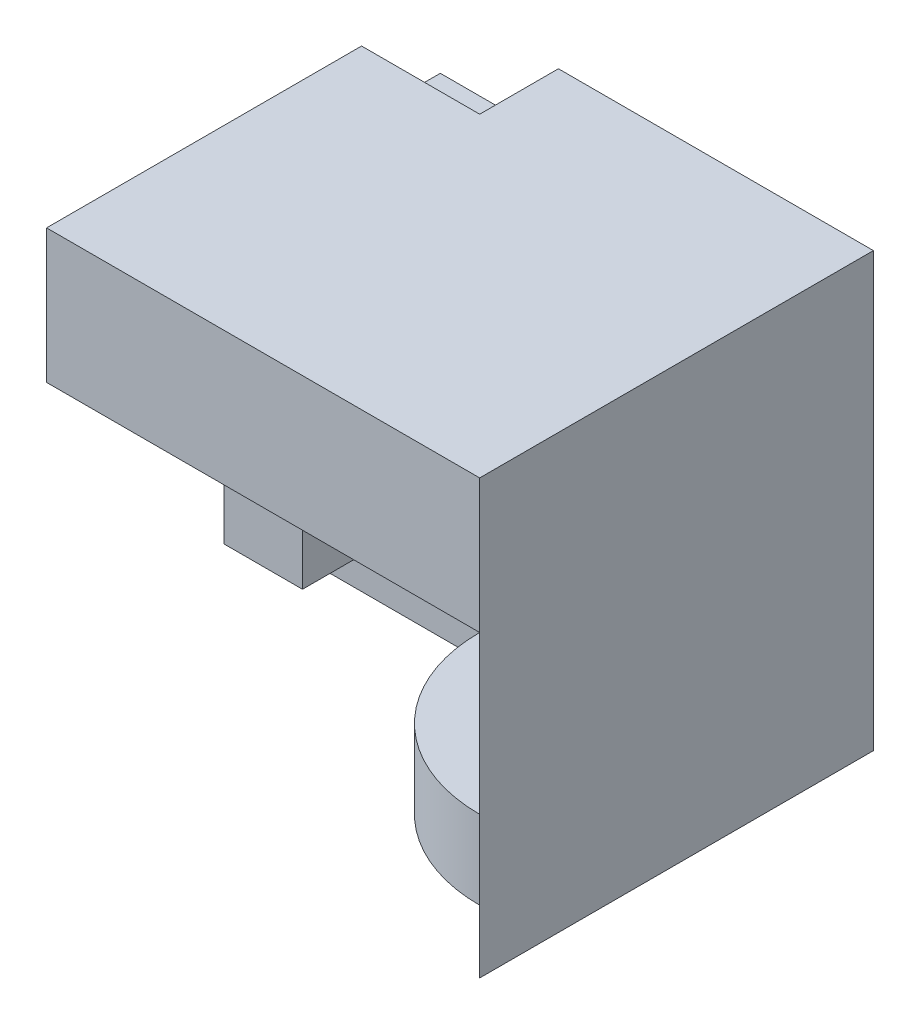
ISO-10303-21;
HEADER;
FILE_DESCRIPTION(('STEP AP214'),'2;1');
FILE_NAME('part.step','',(''),(''),'','','');
FILE_SCHEMA(('AUTOMOTIVE_DESIGN { 1 0 10303 214 1 1 1 1 }'));
ENDSEC;
DATA;
#1=APPLICATION_CONTEXT('core data for automotive mechanical design processes');
#2=APPLICATION_PROTOCOL_DEFINITION('international standard','automotive_design',2000,#1);
#3=PRODUCT_CONTEXT('',#1,'mechanical');
#4=PRODUCT('Part','Part','',(#3));
#5=PRODUCT_RELATED_PRODUCT_CATEGORY('part','',(#4));
#6=PRODUCT_DEFINITION_FORMATION('','',#4);
#7=PRODUCT_DEFINITION_CONTEXT('part definition',#1,'design');
#8=PRODUCT_DEFINITION('design','',#6,#7);
#9=PRODUCT_DEFINITION_SHAPE('','',#8);
#10=(LENGTH_UNIT() NAMED_UNIT(*) SI_UNIT(.MILLI.,.METRE.));
#11=(NAMED_UNIT(*) PLANE_ANGLE_UNIT() SI_UNIT($,.RADIAN.));
#12=(NAMED_UNIT(*) SI_UNIT($,.STERADIAN.) SOLID_ANGLE_UNIT());
#13=UNCERTAINTY_MEASURE_WITH_UNIT(LENGTH_MEASURE(1.E-05),#10,'distance_accuracy_value','');
#14=(GEOMETRIC_REPRESENTATION_CONTEXT(3) GLOBAL_UNCERTAINTY_ASSIGNED_CONTEXT((#13)) GLOBAL_UNIT_ASSIGNED_CONTEXT((#10,
#11,#12)) REPRESENTATION_CONTEXT('',''));
#15=CARTESIAN_POINT('',(0.,0.,0.));
#16=DIRECTION('',(0.,0.,1.));
#17=DIRECTION('',(1.,0.,0.));
#18=AXIS2_PLACEMENT_3D('',#15,#16,#17);
#19=CARTESIAN_POINT('',(7.5,10.5,30.0000000000002));
#20=DIRECTION('',(0.707106781186544,0.,-0.707106781186551));
#21=DIRECTION('',(-0.707106781186551,0.,-0.707106781186544));
#22=AXIS2_PLACEMENT_3D('',#19,#20,#21);
#23=PLANE('',#22);
#24=DIRECTION('',(0.707106781186551,0.,0.707106781186544));
#25=VECTOR('',#24,1.);
#26=CARTESIAN_POINT('',(27.5,-19.5,50.));
#27=LINE('',#26,#25);
#28=CARTESIAN_POINT('',(7.5,-19.5,30.0000000000002));
#29=VERTEX_POINT('',#28);
#30=CARTESIAN_POINT('',(27.5,-19.5,50.));
#31=VERTEX_POINT('',#30);
#32=EDGE_CURVE('E175',#29,#31,#27,.T.);
#33=ORIENTED_EDGE('',*,*,#32,.F.);
#34=DIRECTION('',(0.,-1.,0.));
#35=VECTOR('',#34,1.);
#36=CARTESIAN_POINT('',(7.5,10.5,30.0000000000002));
#37=LINE('',#36,#35);
#38=CARTESIAN_POINT('',(7.5,-27.5,30.0000000000002));
#39=VERTEX_POINT('',#38);
#40=EDGE_CURVE('E238',#29,#39,#37,.T.);
#41=ORIENTED_EDGE('',*,*,#40,.T.);
#42=DIRECTION('',(0.707106781186551,0.,0.707106781186544));
#43=VECTOR('',#42,1.);
#44=CARTESIAN_POINT('',(7.5,-27.5,30.0000000000002));
#45=LINE('',#44,#43);
#46=CARTESIAN_POINT('',(27.5,-27.5,50.));
#47=VERTEX_POINT('',#46);
#48=EDGE_CURVE('E228',#39,#47,#45,.T.);
#49=ORIENTED_EDGE('',*,*,#48,.T.);
#50=DIRECTION('',(0.,1.,0.));
#51=VECTOR('',#50,1.);
#52=CARTESIAN_POINT('',(27.5,-27.5,50.));
#53=LINE('',#52,#51);
#54=EDGE_CURVE('E242',#47,#31,#53,.T.);
#55=ORIENTED_EDGE('',*,*,#54,.T.);
#56=EDGE_LOOP('',(#33,#41,#49,#55));
#57=FACE_BOUND('',#56,.T.);
#58=ADVANCED_FACE('F34',(#57),#23,.F.);
#59=CARTESIAN_POINT('',(0.,0.,50.));
#60=DIRECTION('',(0.,0.,-1.));
#61=DIRECTION('',(-1.,0.,0.));
#62=AXIS2_PLACEMENT_3D('',#59,#60,#61);
#63=PLANE('',#62);
#64=DIRECTION('',(-1.,0.,0.));
#65=VECTOR('',#64,1.);
#66=CARTESIAN_POINT('',(27.5,10.5,50.));
#67=LINE('',#66,#65);
#68=CARTESIAN_POINT('',(27.5,10.5,50.));
#69=VERTEX_POINT('',#68);
#70=CARTESIAN_POINT('',(-27.5,10.5,50.));
#71=VERTEX_POINT('',#70);
#72=EDGE_CURVE('E224',#69,#71,#67,.T.);
#73=ORIENTED_EDGE('',*,*,#72,.F.);
#74=CARTESIAN_POINT('',(27.5,27.5,50.));
#75=VERTEX_POINT('',#74);
#76=EDGE_CURVE('E247',#69,#75,#53,.T.);
#77=ORIENTED_EDGE('',*,*,#76,.T.);
#78=DIRECTION('',(-1.,0.,0.));
#79=VECTOR('',#78,1.);
#80=CARTESIAN_POINT('',(-27.5,27.5,50.));
#81=LINE('',#80,#79);
#82=CARTESIAN_POINT('',(-27.5,27.5,50.));
#83=VERTEX_POINT('',#82);
#84=EDGE_CURVE('E245',#75,#83,#81,.T.);
#85=ORIENTED_EDGE('',*,*,#84,.T.);
#86=DIRECTION('',(0.,-1.,0.));
#87=VECTOR('',#86,1.);
#88=CARTESIAN_POINT('',(-27.5,-27.5,50.));
#89=LINE('',#88,#87);
#90=EDGE_CURVE('E249',#83,#71,#89,.T.);
#91=ORIENTED_EDGE('',*,*,#90,.T.);
#92=EDGE_LOOP('',(#73,#77,#85,#91));
#93=FACE_BOUND('',#92,.T.);
#94=ADVANCED_FACE('F311',(#93),#63,.F.);
#95=CARTESIAN_POINT('',(27.5,-27.5,50.));
#96=DIRECTION('',(-1.,0.,0.));
#97=DIRECTION('',(0.,0.,1.));
#98=AXIS2_PLACEMENT_3D('',#95,#96,#97);
#99=PLANE('',#98);
#100=ORIENTED_EDGE('',*,*,#76,.F.);
#101=CARTESIAN_POINT('',(27.5,-9.5,50.));
#102=VERTEX_POINT('',#101);
#103=EDGE_CURVE('E246',#102,#69,#53,.T.);
#104=ORIENTED_EDGE('',*,*,#103,.F.);
#105=DIRECTION('',(0.,-1.,0.));
#106=VECTOR('',#105,1.);
#107=CARTESIAN_POINT('',(27.5,-9.5,50.));
#108=LINE('',#107,#106);
#109=EDGE_CURVE('E183',#102,#31,#108,.T.);
#110=ORIENTED_EDGE('',*,*,#109,.T.);
#111=ORIENTED_EDGE('',*,*,#54,.F.);
#112=DIRECTION('',(0.,0.,-1.));
#113=VECTOR('',#112,1.);
#114=CARTESIAN_POINT('',(27.5,-27.5,50.));
#115=LINE('',#114,#113);
#116=CARTESIAN_POINT('',(27.5,-27.5,0.));
#117=VERTEX_POINT('',#116);
#118=EDGE_CURVE('E251',#47,#117,#115,.T.);
#119=ORIENTED_EDGE('',*,*,#118,.T.);
#120=DIRECTION('',(0.,1.,0.));
#121=VECTOR('',#120,1.);
#122=CARTESIAN_POINT('',(27.5,-27.5,0.));
#123=LINE('',#122,#121);
#124=CARTESIAN_POINT('',(27.5,27.5,0.));
#125=VERTEX_POINT('',#124);
#126=EDGE_CURVE('E237',#117,#125,#123,.T.);
#127=ORIENTED_EDGE('',*,*,#126,.T.);
#128=DIRECTION('',(0.,0.,-1.));
#129=VECTOR('',#128,1.);
#130=CARTESIAN_POINT('',(27.5,27.5,50.));
#131=LINE('',#130,#129);
#132=EDGE_CURVE('E11',#75,#125,#131,.T.);
#133=ORIENTED_EDGE('',*,*,#132,.F.);
#134=EDGE_LOOP('',(#100,#104,#110,#111,#119,#127,#133));
#135=FACE_BOUND('',#134,.T.);
#136=ADVANCED_FACE('F36',(#135),#99,.F.);
#137=CARTESIAN_POINT('',(-27.5,27.5,50.));
#138=DIRECTION('',(0.,-1.,0.));
#139=DIRECTION('',(0.,0.,-1.));
#140=AXIS2_PLACEMENT_3D('',#137,#138,#139);
#141=PLANE('',#140);
#142=DIRECTION('',(0.,0.,-1.));
#143=VECTOR('',#142,1.);
#144=CARTESIAN_POINT('',(-12.5,27.5,0.));
#145=LINE('',#144,#143);
#146=CARTESIAN_POINT('',(-12.5,27.5,10.));
#147=VERTEX_POINT('',#146);
#148=CARTESIAN_POINT('',(-12.5,27.5,0.));
#149=VERTEX_POINT('',#148);
#150=EDGE_CURVE('E49',#147,#149,#145,.T.);
#151=ORIENTED_EDGE('',*,*,#150,.F.);
#152=DIRECTION('',(-1.,0.,0.));
#153=VECTOR('',#152,1.);
#154=CARTESIAN_POINT('',(-12.5,27.5,10.));
#155=LINE('',#154,#153);
#156=CARTESIAN_POINT('',(-27.5,27.5,10.));
#157=VERTEX_POINT('',#156);
#158=EDGE_CURVE('E167',#147,#157,#155,.T.);
#159=ORIENTED_EDGE('',*,*,#158,.T.);
#160=DIRECTION('',(0.,0.,-1.));
#161=VECTOR('',#160,1.);
#162=CARTESIAN_POINT('',(-27.5,27.5,50.));
#163=LINE('',#162,#161);
#164=EDGE_CURVE('E42',#83,#157,#163,.T.);
#165=ORIENTED_EDGE('',*,*,#164,.F.);
#166=ORIENTED_EDGE('',*,*,#84,.F.);
#167=ORIENTED_EDGE('',*,*,#132,.T.);
#168=DIRECTION('',(-1.,0.,0.));
#169=VECTOR('',#168,1.);
#170=CARTESIAN_POINT('',(-27.5,27.5,0.));
#171=LINE('',#170,#169);
#172=EDGE_CURVE('E254',#125,#149,#171,.T.);
#173=ORIENTED_EDGE('',*,*,#172,.T.);
#174=EDGE_LOOP('',(#151,#159,#165,#166,#167,#173));
#175=FACE_BOUND('',#174,.T.);
#176=ADVANCED_FACE('F272',(#175),#141,.F.);
#177=CARTESIAN_POINT('',(-27.5,-27.5,50.));
#178=DIRECTION('',(1.,0.,0.));
#179=DIRECTION('',(0.,0.,-1.));
#180=AXIS2_PLACEMENT_3D('',#177,#178,#179);
#181=PLANE('',#180);
#182=ORIENTED_EDGE('',*,*,#164,.T.);
#183=DIRECTION('',(0.,1.,0.));
#184=VECTOR('',#183,1.);
#185=CARTESIAN_POINT('',(-27.5,27.5,10.));
#186=LINE('',#185,#184);
#187=CARTESIAN_POINT('',(-27.5,19.5,10.));
#188=VERTEX_POINT('',#187);
#189=EDGE_CURVE('E160',#188,#157,#186,.T.);
#190=ORIENTED_EDGE('',*,*,#189,.F.);
#191=DIRECTION('',(0.,0.,1.));
#192=VECTOR('',#191,1.);
#193=CARTESIAN_POINT('',(-27.5,19.5,0.));
#194=LINE('',#193,#192);
#195=CARTESIAN_POINT('',(-27.5,19.5,0.));
#196=VERTEX_POINT('',#195);
#197=EDGE_CURVE('E277',#196,#188,#194,.T.);
#198=ORIENTED_EDGE('',*,*,#197,.F.);
#199=DIRECTION('',(0.,-1.,0.));
#200=VECTOR('',#199,1.);
#201=CARTESIAN_POINT('',(-27.5,-27.5,0.));
#202=LINE('',#201,#200);
#203=CARTESIAN_POINT('',(-27.5,-27.5,0.));
#204=VERTEX_POINT('',#203);
#205=EDGE_CURVE('E165',#196,#204,#202,.T.);
#206=ORIENTED_EDGE('',*,*,#205,.T.);
#207=DIRECTION('',(0.,0.,-1.));
#208=VECTOR('',#207,1.);
#209=CARTESIAN_POINT('',(-27.5,-27.5,50.));
#210=LINE('',#209,#208);
#211=CARTESIAN_POINT('',(-27.5,-27.5,15.));
#212=VERTEX_POINT('',#211);
#213=EDGE_CURVE('E261',#212,#204,#210,.T.);
#214=ORIENTED_EDGE('',*,*,#213,.F.);
#215=DIRECTION('',(0.,-1.,0.));
#216=VECTOR('',#215,1.);
#217=CARTESIAN_POINT('',(-27.5,10.5,15.));
#218=LINE('',#217,#216);
#219=CARTESIAN_POINT('',(-27.5,-13.5,15.));
#220=VERTEX_POINT('',#219);
#221=EDGE_CURVE('E227',#220,#212,#218,.T.);
#222=ORIENTED_EDGE('',*,*,#221,.F.);
#223=DIRECTION('',(0.,0.565528355551528,0.824728851845978));
#224=VECTOR('',#223,1.);
#225=CARTESIAN_POINT('',(-27.5,10.5,50.));
#226=LINE('',#225,#224);
#227=EDGE_CURVE('E208',#220,#71,#226,.T.);
#228=ORIENTED_EDGE('',*,*,#227,.T.);
#229=ORIENTED_EDGE('',*,*,#90,.F.);
#230=EDGE_LOOP('',(#182,#190,#198,#206,#214,#222,#228,#229));
#231=FACE_BOUND('',#230,.T.);
#232=ADVANCED_FACE('F268',(#231),#181,.F.);
#233=CARTESIAN_POINT('',(-27.5,-27.5,50.));
#234=DIRECTION('',(0.,1.,0.));
#235=DIRECTION('',(0.,0.,1.));
#236=AXIS2_PLACEMENT_3D('',#233,#234,#235);
#237=PLANE('',#236);
#238=ORIENTED_EDGE('',*,*,#118,.F.);
#239=ORIENTED_EDGE('',*,*,#48,.F.);
#240=DIRECTION('',(0.,0.,1.));
#241=VECTOR('',#240,1.);
#242=CARTESIAN_POINT('',(7.5,-27.5,15.));
#243=LINE('',#242,#241);
#244=CARTESIAN_POINT('',(7.5,-27.5,15.));
#245=VERTEX_POINT('',#244);
#246=EDGE_CURVE('E231',#245,#39,#243,.T.);
#247=ORIENTED_EDGE('',*,*,#246,.F.);
#248=DIRECTION('',(1.,0.,0.));
#249=VECTOR('',#248,1.);
#250=CARTESIAN_POINT('',(-27.5,-27.5,15.));
#251=LINE('',#250,#249);
#252=EDGE_CURVE('E223',#212,#245,#251,.T.);
#253=ORIENTED_EDGE('',*,*,#252,.F.);
#254=ORIENTED_EDGE('',*,*,#213,.T.);
#255=DIRECTION('',(1.,0.,0.));
#256=VECTOR('',#255,1.);
#257=CARTESIAN_POINT('',(-27.5,-27.5,0.));
#258=LINE('',#257,#256);
#259=EDGE_CURVE('E257',#204,#117,#258,.T.);
#260=ORIENTED_EDGE('',*,*,#259,.T.);
#261=EDGE_LOOP('',(#238,#239,#247,#253,#254,#260));
#262=FACE_BOUND('',#261,.T.);
#263=ADVANCED_FACE('F285',(#262),#237,.F.);
#264=CARTESIAN_POINT('',(0.,0.,0.));
#265=DIRECTION('',(0.,0.,-1.));
#266=DIRECTION('',(-1.,0.,0.));
#267=AXIS2_PLACEMENT_3D('',#264,#265,#266);
#268=PLANE('',#267);
#269=DIRECTION('',(-1.,0.,0.));
#270=VECTOR('',#269,1.);
#271=CARTESIAN_POINT('',(-12.5,19.5,0.));
#272=LINE('',#271,#270);
#273=CARTESIAN_POINT('',(-12.5,19.5,0.));
#274=VERTEX_POINT('',#273);
#275=EDGE_CURVE('E150',#274,#196,#272,.T.);
#276=ORIENTED_EDGE('',*,*,#275,.F.);
#277=DIRECTION('',(0.,-1.,0.));
#278=VECTOR('',#277,1.);
#279=CARTESIAN_POINT('',(-12.5,27.5,0.));
#280=LINE('',#279,#278);
#281=EDGE_CURVE('E155',#149,#274,#280,.T.);
#282=ORIENTED_EDGE('',*,*,#281,.F.);
#283=ORIENTED_EDGE('',*,*,#172,.F.);
#284=ORIENTED_EDGE('',*,*,#126,.F.);
#285=ORIENTED_EDGE('',*,*,#259,.F.);
#286=ORIENTED_EDGE('',*,*,#205,.F.);
#287=EDGE_LOOP('',(#276,#282,#283,#284,#285,#286));
#288=FACE_BOUND('',#287,.T.);
#289=ADVANCED_FACE('F163',(#288),#268,.T.);
#290=CARTESIAN_POINT('',(7.5,-3.21428571428557,30.0000000000002));
#291=VERTEX_POINT('',#290);
#292=CARTESIAN_POINT('',(7.5,-9.50000000000001,30.0000000000002));
#293=VERTEX_POINT('',#292);
#294=EDGE_CURVE('E235',#291,#293,#37,.T.);
#295=ORIENTED_EDGE('',*,*,#294,.T.);
#296=DIRECTION('',(0.707106781186551,0.,0.707106781186544));
#297=VECTOR('',#296,1.);
#298=CARTESIAN_POINT('',(27.5,-9.5,50.));
#299=LINE('',#298,#297);
#300=EDGE_CURVE('E57',#293,#102,#299,.T.);
#301=ORIENTED_EDGE('',*,*,#300,.T.);
#302=ORIENTED_EDGE('',*,*,#103,.T.);
#303=DIRECTION('',(-0.636258478363028,-0.436291528020357,-0.636258478363021));
#304=VECTOR('',#303,1.);
#305=CARTESIAN_POINT('',(11.3070059484468,-0.603767349636389,33.8070059484469));
#306=LINE('',#305,#304);
#307=EDGE_CURVE('E221',#69,#291,#306,.T.);
#308=ORIENTED_EDGE('',*,*,#307,.T.);
#309=EDGE_LOOP('',(#295,#301,#302,#308));
#310=FACE_BOUND('',#309,.T.);
#311=ADVANCED_FACE('F313',(#310),#23,.F.);
#312=CARTESIAN_POINT('',(7.5,10.5,15.));
#313=DIRECTION('',(1.,0.,0.));
#314=DIRECTION('',(0.,0.,-1.));
#315=AXIS2_PLACEMENT_3D('',#312,#313,#314);
#316=PLANE('',#315);
#317=ORIENTED_EDGE('',*,*,#294,.F.);
#318=DIRECTION('',(0.,-0.565528355551528,-0.824728851845978));
#319=VECTOR('',#318,1.);
#320=CARTESIAN_POINT('',(7.5,-5.82426429761244,26.1937812326485));
#321=LINE('',#320,#319);
#322=CARTESIAN_POINT('',(7.5,-13.5,15.));
#323=VERTEX_POINT('',#322);
#324=EDGE_CURVE('E219',#291,#323,#321,.T.);
#325=ORIENTED_EDGE('',*,*,#324,.T.);
#326=DIRECTION('',(0.,-1.,0.));
#327=VECTOR('',#326,1.);
#328=CARTESIAN_POINT('',(7.5,10.5,15.));
#329=LINE('',#328,#327);
#330=EDGE_CURVE('E239',#323,#245,#329,.T.);
#331=ORIENTED_EDGE('',*,*,#330,.T.);
#332=ORIENTED_EDGE('',*,*,#246,.T.);
#333=ORIENTED_EDGE('',*,*,#40,.F.);
#334=DIRECTION('',(0.,-1.,0.));
#335=VECTOR('',#334,1.);
#336=CARTESIAN_POINT('',(7.5,-9.5,30.0000000000002));
#337=LINE('',#336,#335);
#338=EDGE_CURVE('E177',#293,#29,#337,.T.);
#339=ORIENTED_EDGE('',*,*,#338,.F.);
#340=EDGE_LOOP('',(#317,#325,#331,#332,#333,#339));
#341=FACE_BOUND('',#340,.T.);
#342=ADVANCED_FACE('F297',(#341),#316,.F.);
#343=CARTESIAN_POINT('',(-27.5,10.5,15.));
#344=DIRECTION('',(0.,0.,-1.));
#345=DIRECTION('',(-1.,0.,0.));
#346=AXIS2_PLACEMENT_3D('',#343,#344,#345);
#347=PLANE('',#346);
#348=ORIENTED_EDGE('',*,*,#330,.F.);
#349=DIRECTION('',(-1.,0.,0.));
#350=VECTOR('',#349,1.);
#351=CARTESIAN_POINT('',(69.9381903478459,-13.5,15.));
#352=LINE('',#351,#350);
#353=CARTESIAN_POINT('',(-12.5,-13.5,15.));
#354=VERTEX_POINT('',#353);
#355=EDGE_CURVE('E216',#323,#354,#352,.T.);
#356=ORIENTED_EDGE('',*,*,#355,.T.);
#357=DIRECTION('',(-1.,0.,0.));
#358=VECTOR('',#357,1.);
#359=CARTESIAN_POINT('',(-12.5,-13.5,15.));
#360=LINE('',#359,#358);
#361=CARTESIAN_POINT('',(-22.5,-13.5,15.));
#362=VERTEX_POINT('',#361);
#363=EDGE_CURVE('E198',#354,#362,#360,.T.);
#364=ORIENTED_EDGE('',*,*,#363,.T.);
#365=EDGE_CURVE('E215',#362,#220,#352,.T.);
#366=ORIENTED_EDGE('',*,*,#365,.T.);
#367=ORIENTED_EDGE('',*,*,#221,.T.);
#368=ORIENTED_EDGE('',*,*,#252,.T.);
#369=EDGE_LOOP('',(#348,#356,#364,#366,#367,#368));
#370=FACE_BOUND('',#369,.T.);
#371=ADVANCED_FACE('F302',(#370),#347,.F.);
#372=CARTESIAN_POINT('',(69.9381903478459,10.5,50.));
#373=DIRECTION('',(0.,-0.824728851845978,0.565528355551528));
#374=DIRECTION('',(0.,-0.565528355551528,-0.824728851845978));
#375=AXIS2_PLACEMENT_3D('',#372,#373,#374);
#376=PLANE('',#375);
#377=DIRECTION('',(0.,-0.565528355551528,-0.824728851845978));
#378=VECTOR('',#377,1.);
#379=CARTESIAN_POINT('',(-12.5,-13.5,15.));
#380=LINE('',#379,#378);
#381=CARTESIAN_POINT('',(-12.5,-1.50000000000001,32.5));
#382=VERTEX_POINT('',#381);
#383=EDGE_CURVE('E188',#382,#354,#380,.T.);
#384=ORIENTED_EDGE('',*,*,#383,.T.);
#385=ORIENTED_EDGE('',*,*,#355,.F.);
#386=ORIENTED_EDGE('',*,*,#324,.F.);
#387=ORIENTED_EDGE('',*,*,#307,.F.);
#388=ORIENTED_EDGE('',*,*,#72,.T.);
#389=ORIENTED_EDGE('',*,*,#227,.F.);
#390=ORIENTED_EDGE('',*,*,#365,.F.);
#391=DIRECTION('',(0.,-0.565528355551528,-0.824728851845978));
#392=VECTOR('',#391,1.);
#393=CARTESIAN_POINT('',(-22.5,-13.5,15.));
#394=LINE('',#393,#392);
#395=CARTESIAN_POINT('',(-22.5,-1.5,32.5));
#396=VERTEX_POINT('',#395);
#397=EDGE_CURVE('E185',#396,#362,#394,.T.);
#398=ORIENTED_EDGE('',*,*,#397,.F.);
#399=DIRECTION('',(-1.,0.,0.));
#400=VECTOR('',#399,1.);
#401=CARTESIAN_POINT('',(-12.5,-1.50000000000001,32.5));
#402=LINE('',#401,#400);
#403=EDGE_CURVE('E205',#382,#396,#402,.T.);
#404=ORIENTED_EDGE('',*,*,#403,.F.);
#405=EDGE_LOOP('',(#384,#385,#386,#387,#388,#389,#390,#398,#404));
#406=FACE_BOUND('',#405,.T.);
#407=ADVANCED_FACE('F306',(#406),#376,.T.);
#408=CARTESIAN_POINT('',(-12.5,-1.50000000000001,32.5));
#409=DIRECTION('',(0.,0.,1.));
#410=DIRECTION('',(1.,0.,0.));
#411=AXIS2_PLACEMENT_3D('',#408,#409,#410);
#412=PLANE('',#411);
#413=DIRECTION('',(0.,1.,0.));
#414=VECTOR('',#413,1.);
#415=CARTESIAN_POINT('',(-22.5,-1.50000000000001,32.5));
#416=LINE('',#415,#414);
#417=CARTESIAN_POINT('',(-22.5,-13.5,32.5));
#418=VERTEX_POINT('',#417);
#419=EDGE_CURVE('E192',#418,#396,#416,.T.);
#420=ORIENTED_EDGE('',*,*,#419,.F.);
#421=DIRECTION('',(-1.,0.,0.));
#422=VECTOR('',#421,1.);
#423=CARTESIAN_POINT('',(-12.5,-13.5,32.5));
#424=LINE('',#423,#422);
#425=CARTESIAN_POINT('',(-12.5,-13.5,32.5));
#426=VERTEX_POINT('',#425);
#427=EDGE_CURVE('E209',#426,#418,#424,.T.);
#428=ORIENTED_EDGE('',*,*,#427,.F.);
#429=DIRECTION('',(0.,1.,0.));
#430=VECTOR('',#429,1.);
#431=CARTESIAN_POINT('',(-12.5,-1.50000000000001,32.5));
#432=LINE('',#431,#430);
#433=EDGE_CURVE('E195',#426,#382,#432,.T.);
#434=ORIENTED_EDGE('',*,*,#433,.T.);
#435=ORIENTED_EDGE('',*,*,#403,.T.);
#436=EDGE_LOOP('',(#420,#428,#434,#435));
#437=FACE_BOUND('',#436,.T.);
#438=ADVANCED_FACE('F323',(#437),#412,.T.);
#439=CARTESIAN_POINT('',(-12.5,-13.5,32.5));
#440=DIRECTION('',(0.,-1.,0.));
#441=DIRECTION('',(0.,0.,-1.));
#442=AXIS2_PLACEMENT_3D('',#439,#440,#441);
#443=PLANE('',#442);
#444=DIRECTION('',(0.,0.,1.));
#445=VECTOR('',#444,1.);
#446=CARTESIAN_POINT('',(-22.5,-13.5,32.5));
#447=LINE('',#446,#445);
#448=EDGE_CURVE('E201',#362,#418,#447,.T.);
#449=ORIENTED_EDGE('',*,*,#448,.F.);
#450=ORIENTED_EDGE('',*,*,#363,.F.);
#451=DIRECTION('',(0.,0.,1.));
#452=VECTOR('',#451,1.);
#453=CARTESIAN_POINT('',(-12.5,-13.5,32.5));
#454=LINE('',#453,#452);
#455=EDGE_CURVE('E191',#354,#426,#454,.T.);
#456=ORIENTED_EDGE('',*,*,#455,.T.);
#457=ORIENTED_EDGE('',*,*,#427,.T.);
#458=EDGE_LOOP('',(#449,#450,#456,#457));
#459=FACE_BOUND('',#458,.T.);
#460=ADVANCED_FACE('F317',(#459),#443,.T.);
#461=CARTESIAN_POINT('',(-12.5,0.,0.));
#462=DIRECTION('',(1.,0.,0.));
#463=DIRECTION('',(0.,0.,-1.));
#464=AXIS2_PLACEMENT_3D('',#461,#462,#463);
#465=PLANE('',#464);
#466=ORIENTED_EDGE('',*,*,#383,.F.);
#467=ORIENTED_EDGE('',*,*,#433,.F.);
#468=ORIENTED_EDGE('',*,*,#455,.F.);
#469=EDGE_LOOP('',(#466,#467,#468));
#470=FACE_BOUND('',#469,.T.);
#471=ADVANCED_FACE('F320',(#470),#465,.T.);
#472=CARTESIAN_POINT('',(-22.5,0.,0.));
#473=DIRECTION('',(1.,0.,0.));
#474=DIRECTION('',(0.,0.,-1.));
#475=AXIS2_PLACEMENT_3D('',#472,#473,#474);
#476=PLANE('',#475);
#477=ORIENTED_EDGE('',*,*,#397,.T.);
#478=ORIENTED_EDGE('',*,*,#448,.T.);
#479=ORIENTED_EDGE('',*,*,#419,.T.);
#480=EDGE_LOOP('',(#477,#478,#479));
#481=FACE_BOUND('',#480,.T.);
#482=ADVANCED_FACE('F325',(#481),#476,.F.);
#483=CARTESIAN_POINT('',(27.5,-9.5,30.));
#484=DIRECTION('',(0.,-1.,0.));
#485=DIRECTION('',(0.,0.,-1.));
#486=AXIS2_PLACEMENT_3D('',#483,#484,#485);
#487=CYLINDRICAL_SURFACE('',#486,20.);
#488=CARTESIAN_POINT('',(27.5,-19.5,30.));
#489=DIRECTION('',(0.,-1.,0.));
#490=DIRECTION('',(0.,0.,1.));
#491=AXIS2_PLACEMENT_3D('',#488,#489,#490);
#492=CIRCLE('',#491,20.);
#493=EDGE_CURVE('E178',#31,#29,#492,.T.);
#494=ORIENTED_EDGE('',*,*,#493,.F.);
#495=ORIENTED_EDGE('',*,*,#109,.F.);
#496=CARTESIAN_POINT('',(27.5,-9.5,30.));
#497=DIRECTION('',(0.,-1.,0.));
#498=DIRECTION('',(0.,0.,1.));
#499=AXIS2_PLACEMENT_3D('',#496,#497,#498);
#500=CIRCLE('',#499,20.);
#501=EDGE_CURVE('E172',#102,#293,#500,.T.);
#502=ORIENTED_EDGE('',*,*,#501,.T.);
#503=ORIENTED_EDGE('',*,*,#338,.T.);
#504=EDGE_LOOP('',(#494,#495,#502,#503));
#505=FACE_BOUND('',#504,.T.);
#506=ADVANCED_FACE('F327',(#505),#487,.T.);
#507=CARTESIAN_POINT('',(27.5,-9.5,30.));
#508=DIRECTION('',(0.,1.,0.));
#509=DIRECTION('',(0.,0.,1.));
#510=AXIS2_PLACEMENT_3D('',#507,#508,#509);
#511=PLANE('',#510);
#512=ORIENTED_EDGE('',*,*,#501,.F.);
#513=ORIENTED_EDGE('',*,*,#300,.F.);
#514=EDGE_LOOP('',(#512,#513));
#515=FACE_BOUND('',#514,.T.);
#516=ADVANCED_FACE('F333',(#515),#511,.T.);
#517=CARTESIAN_POINT('',(27.5,-19.5,30.));
#518=DIRECTION('',(0.,1.,0.));
#519=DIRECTION('',(0.,0.,1.));
#520=AXIS2_PLACEMENT_3D('',#517,#518,#519);
#521=PLANE('',#520);
#522=ORIENTED_EDGE('',*,*,#493,.T.);
#523=ORIENTED_EDGE('',*,*,#32,.T.);
#524=EDGE_LOOP('',(#522,#523));
#525=FACE_BOUND('',#524,.T.);
#526=ADVANCED_FACE('F435',(#525),#521,.F.);
#527=CARTESIAN_POINT('',(-12.5,27.5,10.));
#528=DIRECTION('',(0.,0.,1.));
#529=DIRECTION('',(0.,-1.,0.));
#530=AXIS2_PLACEMENT_3D('',#527,#528,#529);
#531=PLANE('',#530);
#532=ORIENTED_EDGE('',*,*,#189,.T.);
#533=ORIENTED_EDGE('',*,*,#158,.F.);
#534=DIRECTION('',(0.,1.,0.));
#535=VECTOR('',#534,1.);
#536=CARTESIAN_POINT('',(-12.5,27.5,10.));
#537=LINE('',#536,#535);
#538=CARTESIAN_POINT('',(-12.5,19.5,10.));
#539=VERTEX_POINT('',#538);
#540=EDGE_CURVE('E154',#539,#147,#537,.T.);
#541=ORIENTED_EDGE('',*,*,#540,.F.);
#542=DIRECTION('',(-1.,0.,0.));
#543=VECTOR('',#542,1.);
#544=CARTESIAN_POINT('',(-12.5,19.5,10.));
#545=LINE('',#544,#543);
#546=EDGE_CURVE('E152',#539,#188,#545,.T.);
#547=ORIENTED_EDGE('',*,*,#546,.T.);
#548=EDGE_LOOP('',(#532,#533,#541,#547));
#549=FACE_BOUND('',#548,.T.);
#550=ADVANCED_FACE('F279',(#549),#531,.F.);
#551=CARTESIAN_POINT('',(-12.5,19.5,0.));
#552=DIRECTION('',(0.,-1.,0.));
#553=DIRECTION('',(0.,0.,-1.));
#554=AXIS2_PLACEMENT_3D('',#551,#552,#553);
#555=PLANE('',#554);
#556=ORIENTED_EDGE('',*,*,#197,.T.);
#557=ORIENTED_EDGE('',*,*,#546,.F.);
#558=DIRECTION('',(0.,0.,1.));
#559=VECTOR('',#558,1.);
#560=CARTESIAN_POINT('',(-12.5,19.5,0.));
#561=LINE('',#560,#559);
#562=EDGE_CURVE('E146',#274,#539,#561,.T.);
#563=ORIENTED_EDGE('',*,*,#562,.F.);
#564=ORIENTED_EDGE('',*,*,#275,.T.);
#565=EDGE_LOOP('',(#556,#557,#563,#564));
#566=FACE_BOUND('',#565,.T.);
#567=ADVANCED_FACE('F148',(#566),#555,.F.);
#568=CARTESIAN_POINT('',(-12.5,0.,0.));
#569=DIRECTION('',(-1.,0.,0.));
#570=DIRECTION('',(0.,0.,1.));
#571=AXIS2_PLACEMENT_3D('',#568,#569,#570);
#572=PLANE('',#571);
#573=ORIENTED_EDGE('',*,*,#281,.T.);
#574=ORIENTED_EDGE('',*,*,#562,.T.);
#575=ORIENTED_EDGE('',*,*,#540,.T.);
#576=ORIENTED_EDGE('',*,*,#150,.T.);
#577=EDGE_LOOP('',(#573,#574,#575,#576));
#578=FACE_BOUND('',#577,.T.);
#579=ADVANCED_FACE('F157',(#578),#572,.T.);
#580=CLOSED_SHELL('',(#58,#94,#136,#176,#232,#263,#289,#311,#342,#371,#407,#438,#460,#471,#482,
#506,#516,#526,#550,#567,#579));
#581=MANIFOLD_SOLID_BREP('B2',#580);
#582=ADVANCED_BREP_SHAPE_REPRESENTATION('',(#18,#581),#14);
#583=SHAPE_DEFINITION_REPRESENTATION(#9,#582);
ENDSEC;
END-ISO-10303-21;
